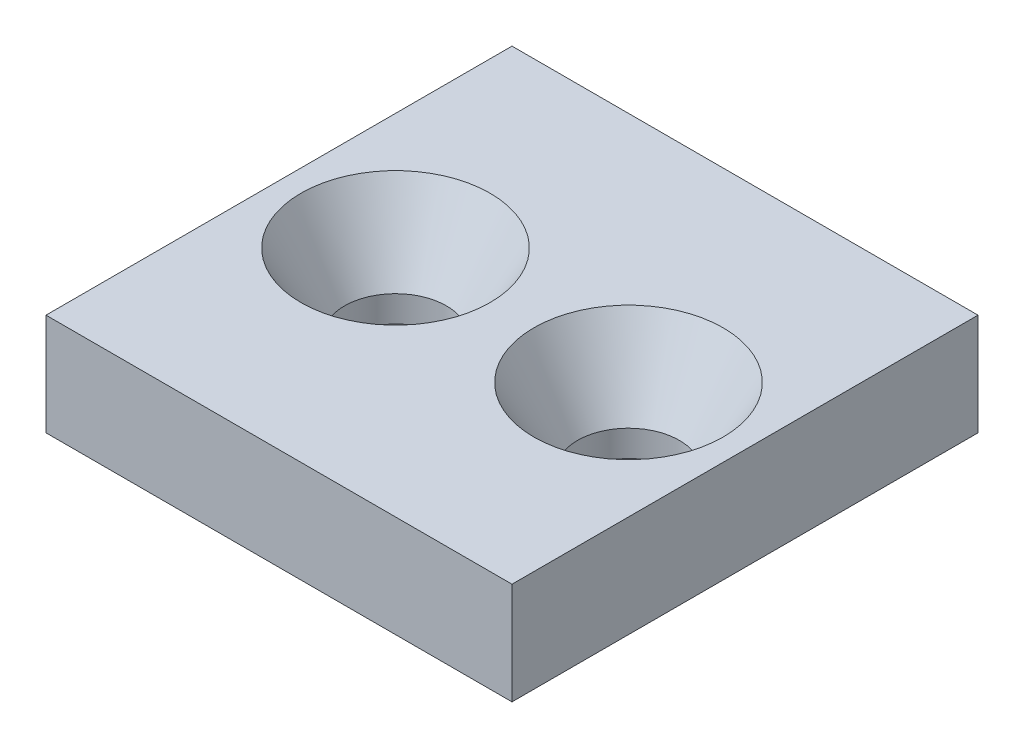
ISO-10303-21;
HEADER;
FILE_DESCRIPTION(('STEP AP214'),'2;1');
FILE_NAME('part.step','',(''),(''),'','','');
FILE_SCHEMA(('AUTOMOTIVE_DESIGN { 1 0 10303 214 1 1 1 1 }'));
ENDSEC;
DATA;
#1=APPLICATION_CONTEXT('core data for automotive mechanical design processes');
#2=APPLICATION_PROTOCOL_DEFINITION('international standard','automotive_design',2000,#1);
#3=PRODUCT_CONTEXT('',#1,'mechanical');
#4=PRODUCT('Part','Part','',(#3));
#5=PRODUCT_RELATED_PRODUCT_CATEGORY('part','',(#4));
#6=PRODUCT_DEFINITION_FORMATION('','',#4);
#7=PRODUCT_DEFINITION_CONTEXT('part definition',#1,'design');
#8=PRODUCT_DEFINITION('design','',#6,#7);
#9=PRODUCT_DEFINITION_SHAPE('','',#8);
#10=(LENGTH_UNIT() NAMED_UNIT(*) SI_UNIT(.MILLI.,.METRE.));
#11=(NAMED_UNIT(*) PLANE_ANGLE_UNIT() SI_UNIT($,.RADIAN.));
#12=(NAMED_UNIT(*) SI_UNIT($,.STERADIAN.) SOLID_ANGLE_UNIT());
#13=UNCERTAINTY_MEASURE_WITH_UNIT(LENGTH_MEASURE(1.E-05),#10,'distance_accuracy_value','');
#14=(GEOMETRIC_REPRESENTATION_CONTEXT(3) GLOBAL_UNCERTAINTY_ASSIGNED_CONTEXT((#13)) GLOBAL_UNIT_ASSIGNED_CONTEXT((#10,
#11,#12)) REPRESENTATION_CONTEXT('',''));
#15=CARTESIAN_POINT('',(0.,0.,0.));
#16=DIRECTION('',(0.,0.,1.));
#17=DIRECTION('',(1.,0.,0.));
#18=AXIS2_PLACEMENT_3D('',#15,#16,#17);
#19=CARTESIAN_POINT('',(16.0000000000004,7.00000000000001,16.0000000000003));
#20=DIRECTION('',(-1.00000000000002,0.,0.));
#21=DIRECTION('',(0.,0.,1.00000000000002));
#22=AXIS2_PLACEMENT_3D('',#19,#20,#21);
#23=PLANE('',#22);
#24=DIRECTION('',(0.,0.,-1.00000000000002));
#25=VECTOR('',#24,1.);
#26=CARTESIAN_POINT('',(16.0000000000007,1.59594559789866E-13,16.0000000000003));
#27=LINE('',#26,#25);
#28=CARTESIAN_POINT('',(16.0000000000007,1.59594559789866E-13,16.0000000000003));
#29=VERTEX_POINT('',#28);
#30=CARTESIAN_POINT('',(16.0000000000007,1.59594559789866E-13,-16.0000000000003));
#31=VERTEX_POINT('',#30);
#32=EDGE_CURVE('E109',#29,#31,#27,.T.);
#33=ORIENTED_EDGE('',*,*,#32,.T.);
#34=DIRECTION('',(0.,-1.,0.));
#35=VECTOR('',#34,1.);
#36=CARTESIAN_POINT('',(16.0000000000004,7.00000000000001,-16.0000000000003));
#37=LINE('',#36,#35);
#38=CARTESIAN_POINT('',(16.0000000000004,7.00000000000001,-16.0000000000003));
#39=VERTEX_POINT('',#38);
#40=EDGE_CURVE('E11',#39,#31,#37,.T.);
#41=ORIENTED_EDGE('',*,*,#40,.F.);
#42=DIRECTION('',(0.,0.,-1.00000000000002));
#43=VECTOR('',#42,1.);
#44=CARTESIAN_POINT('',(16.0000000000004,7.00000000000001,16.0000000000003));
#45=LINE('',#44,#43);
#46=CARTESIAN_POINT('',(16.0000000000004,7.00000000000001,16.0000000000003));
#47=VERTEX_POINT('',#46);
#48=EDGE_CURVE('E92',#47,#39,#45,.T.);
#49=ORIENTED_EDGE('',*,*,#48,.F.);
#50=DIRECTION('',(0.,-1.,0.));
#51=VECTOR('',#50,1.);
#52=CARTESIAN_POINT('',(16.0000000000004,7.00000000000001,16.0000000000003));
#53=LINE('',#52,#51);
#54=EDGE_CURVE('E105',#47,#29,#53,.T.);
#55=ORIENTED_EDGE('',*,*,#54,.T.);
#56=EDGE_LOOP('',(#33,#41,#49,#55));
#57=FACE_BOUND('',#56,.T.);
#58=ADVANCED_FACE('F40',(#57),#23,.F.);
#59=CARTESIAN_POINT('',(-16.0000000000004,7.00000000000001,-16.0000000000003));
#60=DIRECTION('',(0.,0.,1.00000000000002));
#61=DIRECTION('',(1.00000000000002,0.,0.));
#62=AXIS2_PLACEMENT_3D('',#59,#60,#61);
#63=PLANE('',#62);
#64=DIRECTION('',(-1.00000000000002,0.,0.));
#65=VECTOR('',#64,1.);
#66=CARTESIAN_POINT('',(-16.0000000000004,0.,-16.0000000000003));
#67=LINE('',#66,#65);
#68=CARTESIAN_POINT('',(-16.0000000000004,0.,-16.0000000000003));
#69=VERTEX_POINT('',#68);
#70=EDGE_CURVE('E97',#31,#69,#67,.T.);
#71=ORIENTED_EDGE('',*,*,#70,.T.);
#72=DIRECTION('',(0.,-1.,0.));
#73=VECTOR('',#72,1.);
#74=CARTESIAN_POINT('',(-16.0000000000004,7.00000000000001,-16.0000000000003));
#75=LINE('',#74,#73);
#76=CARTESIAN_POINT('',(-16.0000000000004,7.00000000000001,-16.0000000000003));
#77=VERTEX_POINT('',#76);
#78=EDGE_CURVE('E49',#77,#69,#75,.T.);
#79=ORIENTED_EDGE('',*,*,#78,.F.);
#80=DIRECTION('',(-1.00000000000002,0.,0.));
#81=VECTOR('',#80,1.);
#82=CARTESIAN_POINT('',(-16.0000000000004,7.00000000000001,-16.0000000000003));
#83=LINE('',#82,#81);
#84=EDGE_CURVE('E87',#39,#77,#83,.T.);
#85=ORIENTED_EDGE('',*,*,#84,.F.);
#86=ORIENTED_EDGE('',*,*,#40,.T.);
#87=EDGE_LOOP('',(#71,#79,#85,#86));
#88=FACE_BOUND('',#87,.T.);
#89=ADVANCED_FACE('F96',(#88),#63,.F.);
#90=CARTESIAN_POINT('',(-16.0000000000004,7.00000000000001,16.0000000000003));
#91=DIRECTION('',(1.00000000000002,0.,0.));
#92=DIRECTION('',(0.,0.,-1.00000000000002));
#93=AXIS2_PLACEMENT_3D('',#90,#91,#92);
#94=PLANE('',#93);
#95=DIRECTION('',(0.,0.,1.00000000000002));
#96=VECTOR('',#95,1.);
#97=CARTESIAN_POINT('',(-16.0000000000004,0.,16.0000000000003));
#98=LINE('',#97,#96);
#99=CARTESIAN_POINT('',(-16.0000000000004,0.,16.0000000000003));
#100=VERTEX_POINT('',#99);
#101=EDGE_CURVE('E74',#69,#100,#98,.T.);
#102=ORIENTED_EDGE('',*,*,#101,.T.);
#103=DIRECTION('',(0.,-1.,0.));
#104=VECTOR('',#103,1.);
#105=CARTESIAN_POINT('',(-16.0000000000004,7.00000000000001,16.0000000000003));
#106=LINE('',#105,#104);
#107=CARTESIAN_POINT('',(-16.0000000000004,7.00000000000001,16.0000000000003));
#108=VERTEX_POINT('',#107);
#109=EDGE_CURVE('E99',#108,#100,#106,.T.);
#110=ORIENTED_EDGE('',*,*,#109,.F.);
#111=DIRECTION('',(0.,0.,1.00000000000002));
#112=VECTOR('',#111,1.);
#113=CARTESIAN_POINT('',(-16.0000000000004,7.00000000000001,16.0000000000003));
#114=LINE('',#113,#112);
#115=EDGE_CURVE('E90',#77,#108,#114,.T.);
#116=ORIENTED_EDGE('',*,*,#115,.F.);
#117=ORIENTED_EDGE('',*,*,#78,.T.);
#118=EDGE_LOOP('',(#102,#110,#116,#117));
#119=FACE_BOUND('',#118,.T.);
#120=ADVANCED_FACE('F100',(#119),#94,.F.);
#121=CARTESIAN_POINT('',(-16.0000000000004,7.00000000000001,16.0000000000003));
#122=DIRECTION('',(0.,0.,-1.00000000000002));
#123=DIRECTION('',(-1.00000000000002,0.,0.));
#124=AXIS2_PLACEMENT_3D('',#121,#122,#123);
#125=PLANE('',#124);
#126=DIRECTION('',(1.00000000000002,0.,0.));
#127=VECTOR('',#126,1.);
#128=CARTESIAN_POINT('',(-16.0000000000004,0.,16.0000000000003));
#129=LINE('',#128,#127);
#130=EDGE_CURVE('E80',#100,#29,#129,.T.);
#131=ORIENTED_EDGE('',*,*,#130,.T.);
#132=ORIENTED_EDGE('',*,*,#54,.F.);
#133=DIRECTION('',(1.00000000000002,0.,0.));
#134=VECTOR('',#133,1.);
#135=CARTESIAN_POINT('',(-16.0000000000004,7.00000000000001,16.0000000000003));
#136=LINE('',#135,#134);
#137=EDGE_CURVE('E57',#108,#47,#136,.T.);
#138=ORIENTED_EDGE('',*,*,#137,.F.);
#139=ORIENTED_EDGE('',*,*,#109,.T.);
#140=EDGE_LOOP('',(#131,#132,#138,#139));
#141=FACE_BOUND('',#140,.T.);
#142=ADVANCED_FACE('F124',(#141),#125,.F.);
#143=CARTESIAN_POINT('',(-1.45716771982052E-13,7.00000000000002,0.));
#144=DIRECTION('',(0.,-1.,0.));
#145=DIRECTION('',(0.,0.,-1.00000000000002));
#146=AXIS2_PLACEMENT_3D('',#143,#144,#145);
#147=PLANE('',#146);
#148=CARTESIAN_POINT('',(-8.00000000000007,6.99999999999999,0.));
#149=DIRECTION('',(0.,1.,0.));
#150=DIRECTION('',(0.,0.,1.00000000000002));
#151=AXIS2_PLACEMENT_3D('',#148,#149,#150);
#152=CIRCLE('',#151,6.5);
#153=CARTESIAN_POINT('',(-8.00000000000007,6.99999999999999,6.50000000000015));
#154=VERTEX_POINT('',#153);
#155=EDGE_CURVE('E151',#154,#154,#152,.T.);
#156=ORIENTED_EDGE('',*,*,#155,.F.);
#157=EDGE_LOOP('',(#156));
#158=FACE_BOUND('',#157,.T.);
#159=CARTESIAN_POINT('',(8.00000000000001,7.00000000000001,0.));
#160=DIRECTION('',(0.,1.,0.));
#161=DIRECTION('',(0.,0.,1.00000000000002));
#162=AXIS2_PLACEMENT_3D('',#159,#160,#161);
#163=CIRCLE('',#162,6.5);
#164=CARTESIAN_POINT('',(8.00000000000001,7.00000000000001,6.50000000000014));
#165=VERTEX_POINT('',#164);
#166=EDGE_CURVE('E139',#165,#165,#163,.T.);
#167=ORIENTED_EDGE('',*,*,#166,.F.);
#168=EDGE_LOOP('',(#167));
#169=FACE_BOUND('',#168,.T.);
#170=ORIENTED_EDGE('',*,*,#48,.T.);
#171=ORIENTED_EDGE('',*,*,#84,.T.);
#172=ORIENTED_EDGE('',*,*,#115,.T.);
#173=ORIENTED_EDGE('',*,*,#137,.T.);
#174=EDGE_LOOP('',(#170,#171,#172,#173));
#175=FACE_BOUND('',#174,.T.);
#176=ADVANCED_FACE('F88',(#158,#169,#175),#147,.F.);
#177=CARTESIAN_POINT('',(0.,0.,0.));
#178=DIRECTION('',(0.,-1.,0.));
#179=DIRECTION('',(0.,0.,-1.00000000000002));
#180=AXIS2_PLACEMENT_3D('',#177,#178,#179);
#181=PLANE('',#180);
#182=CARTESIAN_POINT('',(-8.00000000000015,0.,0.));
#183=DIRECTION('',(0.,1.,0.));
#184=DIRECTION('',(0.,0.,1.00000000000002));
#185=AXIS2_PLACEMENT_3D('',#182,#183,#184);
#186=CIRCLE('',#185,3.5);
#187=CARTESIAN_POINT('',(-8.00000000000015,0.,3.50000000000008));
#188=VERTEX_POINT('',#187);
#189=EDGE_CURVE('E143',#188,#188,#186,.T.);
#190=ORIENTED_EDGE('',*,*,#189,.T.);
#191=EDGE_LOOP('',(#190));
#192=FACE_BOUND('',#191,.T.);
#193=CARTESIAN_POINT('',(8.,0.,0.));
#194=DIRECTION('',(0.,1.,0.));
#195=DIRECTION('',(0.,0.,1.00000000000002));
#196=AXIS2_PLACEMENT_3D('',#193,#194,#195);
#197=CIRCLE('',#196,3.5);
#198=CARTESIAN_POINT('',(8.,0.,3.50000000000008));
#199=VERTEX_POINT('',#198);
#200=EDGE_CURVE('E113',#199,#199,#197,.T.);
#201=ORIENTED_EDGE('',*,*,#200,.T.);
#202=EDGE_LOOP('',(#201));
#203=FACE_BOUND('',#202,.T.);
#204=ORIENTED_EDGE('',*,*,#32,.F.);
#205=ORIENTED_EDGE('',*,*,#130,.F.);
#206=ORIENTED_EDGE('',*,*,#101,.F.);
#207=ORIENTED_EDGE('',*,*,#70,.F.);
#208=EDGE_LOOP('',(#204,#205,#206,#207));
#209=FACE_BOUND('',#208,.T.);
#210=ADVANCED_FACE('F127',(#192,#203,#209),#181,.T.);
#211=CARTESIAN_POINT('',(8.00000000000001,7.00000000000001,0.));
#212=DIRECTION('',(0.,1.,0.));
#213=DIRECTION('',(0.,0.,1.00000000000002));
#214=AXIS2_PLACEMENT_3D('',#211,#212,#213);
#215=CYLINDRICAL_SURFACE('',#214,3.5);
#216=ORIENTED_EDGE('',*,*,#200,.F.);
#217=EDGE_LOOP('',(#216));
#218=FACE_BOUND('',#217,.T.);
#219=CARTESIAN_POINT('',(8.,1.80384757729336,0.));
#220=DIRECTION('',(0.,1.,0.));
#221=DIRECTION('',(0.,0.,1.00000000000002));
#222=AXIS2_PLACEMENT_3D('',#219,#220,#221);
#223=CIRCLE('',#222,3.5);
#224=CARTESIAN_POINT('',(8.,1.80384757729336,3.50000000000008));
#225=VERTEX_POINT('',#224);
#226=EDGE_CURVE('E135',#225,#225,#223,.T.);
#227=ORIENTED_EDGE('',*,*,#226,.T.);
#228=EDGE_LOOP('',(#227));
#229=FACE_BOUND('',#228,.T.);
#230=ADVANCED_FACE('F167',(#218,#229),#215,.F.);
#231=CARTESIAN_POINT('',(8.00000000000001,7.00000000000001,0.));
#232=DIRECTION('',(0.,1.,0.));
#233=DIRECTION('',(0.,0.,1.00000000000002));
#234=AXIS2_PLACEMENT_3D('',#231,#232,#233);
#235=CONICAL_SURFACE('',#234,6.5,0.523598775598298);
#236=ORIENTED_EDGE('',*,*,#226,.F.);
#237=EDGE_LOOP('',(#236));
#238=FACE_BOUND('',#237,.T.);
#239=ORIENTED_EDGE('',*,*,#166,.T.);
#240=EDGE_LOOP('',(#239));
#241=FACE_BOUND('',#240,.T.);
#242=ADVANCED_FACE('F164',(#238,#241),#235,.F.);
#243=CARTESIAN_POINT('',(-8.00000000000007,6.99999999999999,0.));
#244=DIRECTION('',(0.,1.,0.));
#245=DIRECTION('',(0.,0.,1.00000000000002));
#246=AXIS2_PLACEMENT_3D('',#243,#244,#245);
#247=CYLINDRICAL_SURFACE('',#246,3.5);
#248=ORIENTED_EDGE('',*,*,#189,.F.);
#249=EDGE_LOOP('',(#248));
#250=FACE_BOUND('',#249,.T.);
#251=CARTESIAN_POINT('',(-8.00000000000015,1.80384757729336,0.));
#252=DIRECTION('',(0.,1.,0.));
#253=DIRECTION('',(0.,0.,1.00000000000002));
#254=AXIS2_PLACEMENT_3D('',#251,#252,#253);
#255=CIRCLE('',#254,3.5);
#256=CARTESIAN_POINT('',(-8.00000000000015,1.80384757729336,3.50000000000008));
#257=VERTEX_POINT('',#256);
#258=EDGE_CURVE('E147',#257,#257,#255,.T.);
#259=ORIENTED_EDGE('',*,*,#258,.T.);
#260=EDGE_LOOP('',(#259));
#261=FACE_BOUND('',#260,.T.);
#262=ADVANCED_FACE('F166',(#250,#261),#247,.F.);
#263=CARTESIAN_POINT('',(-8.00000000000007,6.99999999999999,0.));
#264=DIRECTION('',(0.,1.,0.));
#265=DIRECTION('',(0.,0.,1.00000000000002));
#266=AXIS2_PLACEMENT_3D('',#263,#264,#265);
#267=CONICAL_SURFACE('',#266,6.5,0.523598775598298);
#268=ORIENTED_EDGE('',*,*,#258,.F.);
#269=EDGE_LOOP('',(#268));
#270=FACE_BOUND('',#269,.T.);
#271=ORIENTED_EDGE('',*,*,#155,.T.);
#272=EDGE_LOOP('',(#271));
#273=FACE_BOUND('',#272,.T.);
#274=ADVANCED_FACE('F157',(#270,#273),#267,.F.);
#275=CLOSED_SHELL('',(#58,#89,#120,#142,#176,#210,#230,#242,#262,#274));
#276=MANIFOLD_SOLID_BREP('B2',#275);
#277=ADVANCED_BREP_SHAPE_REPRESENTATION('',(#18,#276),#14);
#278=SHAPE_DEFINITION_REPRESENTATION(#9,#277);
ENDSEC;
END-ISO-10303-21;
